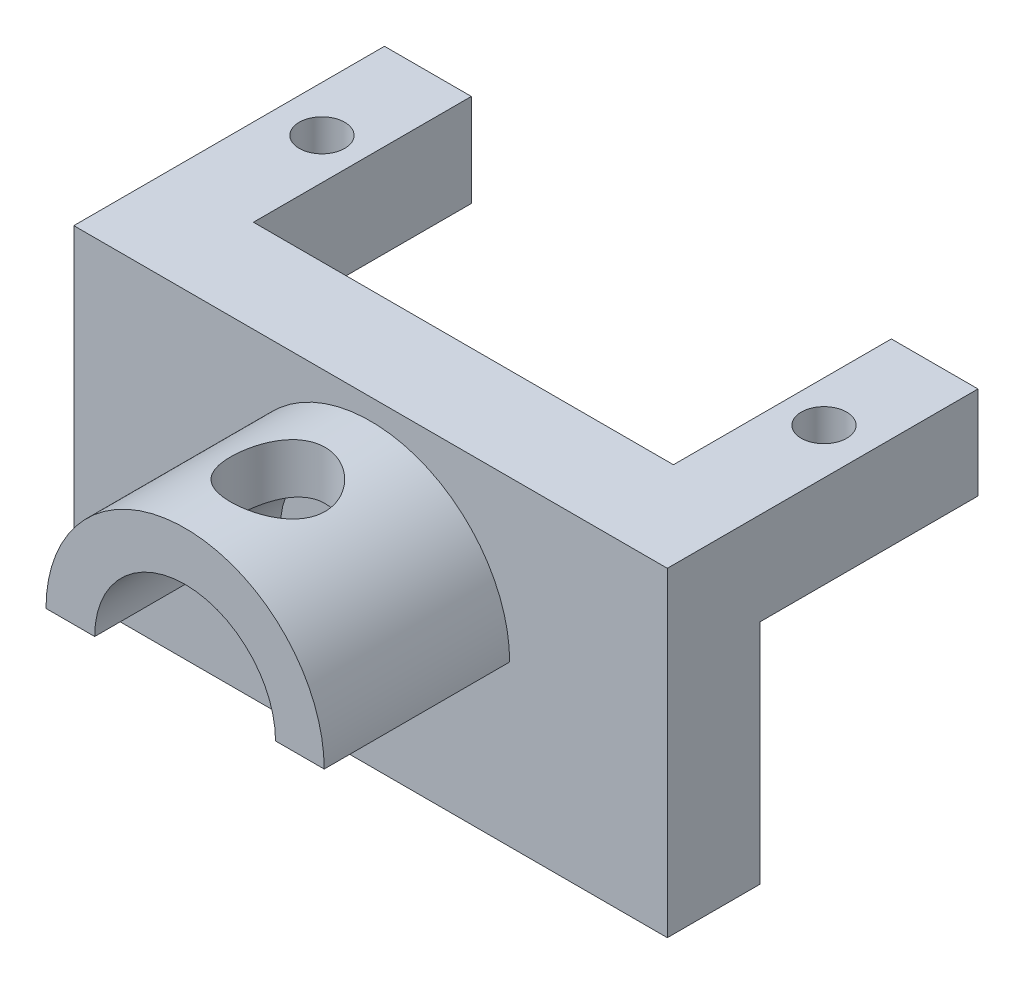
ISO-10303-21;
HEADER;
FILE_DESCRIPTION(('STEP AP214'),'2;1');
FILE_NAME('part.step','',(''),(''),'','','');
FILE_SCHEMA(('AUTOMOTIVE_DESIGN { 1 0 10303 214 1 1 1 1 }'));
ENDSEC;
DATA;
#1=APPLICATION_CONTEXT('core data for automotive mechanical design processes');
#2=APPLICATION_PROTOCOL_DEFINITION('international standard','automotive_design',2000,#1);
#3=PRODUCT_CONTEXT('',#1,'mechanical');
#4=PRODUCT('Part','Part','',(#3));
#5=PRODUCT_RELATED_PRODUCT_CATEGORY('part','',(#4));
#6=PRODUCT_DEFINITION_FORMATION('','',#4);
#7=PRODUCT_DEFINITION_CONTEXT('part definition',#1,'design');
#8=PRODUCT_DEFINITION('design','',#6,#7);
#9=PRODUCT_DEFINITION_SHAPE('','',#8);
#10=(LENGTH_UNIT() NAMED_UNIT(*) SI_UNIT(.MILLI.,.METRE.));
#11=(NAMED_UNIT(*) PLANE_ANGLE_UNIT() SI_UNIT($,.RADIAN.));
#12=(NAMED_UNIT(*) SI_UNIT($,.STERADIAN.) SOLID_ANGLE_UNIT());
#13=UNCERTAINTY_MEASURE_WITH_UNIT(LENGTH_MEASURE(1.E-05),#10,'distance_accuracy_value','');
#14=(GEOMETRIC_REPRESENTATION_CONTEXT(3) GLOBAL_UNCERTAINTY_ASSIGNED_CONTEXT((#13)) GLOBAL_UNIT_ASSIGNED_CONTEXT((#10,
#11,#12)) REPRESENTATION_CONTEXT('',''));
#15=CARTESIAN_POINT('',(0.,0.,0.));
#16=DIRECTION('',(0.,0.,1.));
#17=DIRECTION('',(1.,0.,0.));
#18=AXIS2_PLACEMENT_3D('',#15,#16,#17);
#19=CARTESIAN_POINT('',(0.,0.,5.08));
#20=DIRECTION('',(0.,0.,-1.));
#21=DIRECTION('',(-1.,0.,0.));
#22=AXIS2_PLACEMENT_3D('',#19,#20,#21);
#23=PLANE('',#22);
#24=DIRECTION('',(0.,1.,0.));
#25=VECTOR('',#24,1.);
#26=CARTESIAN_POINT('',(16.256,-8.763,5.08));
#27=LINE('',#26,#25);
#28=CARTESIAN_POINT('',(16.256,-8.763,5.08));
#29=VERTEX_POINT('',#28);
#30=CARTESIAN_POINT('',(16.256,8.763,5.08));
#31=VERTEX_POINT('',#30);
#32=EDGE_CURVE('E261',#29,#31,#27,.T.);
#33=ORIENTED_EDGE('',*,*,#32,.T.);
#34=DIRECTION('',(-1.,0.,0.));
#35=VECTOR('',#34,1.);
#36=CARTESIAN_POINT('',(-16.256,8.763,5.08));
#37=LINE('',#36,#35);
#38=CARTESIAN_POINT('',(-16.256,8.763,5.08));
#39=VERTEX_POINT('',#38);
#40=EDGE_CURVE('E265',#31,#39,#37,.T.);
#41=ORIENTED_EDGE('',*,*,#40,.T.);
#42=DIRECTION('',(0.,-1.,0.));
#43=VECTOR('',#42,1.);
#44=CARTESIAN_POINT('',(-16.256,-8.763,5.08));
#45=LINE('',#44,#43);
#46=CARTESIAN_POINT('',(-16.256,-8.763,5.08));
#47=VERTEX_POINT('',#46);
#48=EDGE_CURVE('E269',#39,#47,#45,.T.);
#49=ORIENTED_EDGE('',*,*,#48,.T.);
#50=DIRECTION('',(1.,0.,0.));
#51=VECTOR('',#50,1.);
#52=CARTESIAN_POINT('',(-16.256,-8.763,5.08));
#53=LINE('',#52,#51);
#54=EDGE_CURVE('E272',#47,#29,#53,.T.);
#55=ORIENTED_EDGE('',*,*,#54,.T.);
#56=EDGE_LOOP('',(#33,#41,#49,#55));
#57=FACE_BOUND('',#56,.T.);
#58=CARTESIAN_POINT('',(0.,0.,5.08));
#59=DIRECTION('',(0.,0.,1.));
#60=DIRECTION('',(1.,0.,0.));
#61=AXIS2_PLACEMENT_3D('',#58,#59,#60);
#62=CIRCLE('',#61,7.62);
#63=CARTESIAN_POINT('',(7.62,0.,5.08));
#64=VERTEX_POINT('',#63);
#65=CARTESIAN_POINT('',(-7.62,0.,5.08));
#66=VERTEX_POINT('',#65);
#67=EDGE_CURVE('E172',#64,#66,#62,.T.);
#68=ORIENTED_EDGE('',*,*,#67,.F.);
#69=DIRECTION('',(1.,0.,0.));
#70=VECTOR('',#69,1.);
#71=CARTESIAN_POINT('',(7.62,0.,5.08));
#72=LINE('',#71,#70);
#73=CARTESIAN_POINT('',(4.953,0.,5.08));
#74=VERTEX_POINT('',#73);
#75=EDGE_CURVE('E169',#74,#64,#72,.T.);
#76=ORIENTED_EDGE('',*,*,#75,.F.);
#77=CARTESIAN_POINT('',(0.,0.,5.08));
#78=DIRECTION('',(0.,0.,-1.));
#79=DIRECTION('',(1.,0.,0.));
#80=AXIS2_PLACEMENT_3D('',#77,#78,#79);
#81=CIRCLE('',#80,4.953);
#82=CARTESIAN_POINT('',(-4.953,0.,5.08));
#83=VERTEX_POINT('',#82);
#84=EDGE_CURVE('E69',#83,#74,#81,.T.);
#85=ORIENTED_EDGE('',*,*,#84,.F.);
#86=DIRECTION('',(1.,0.,0.));
#87=VECTOR('',#86,1.);
#88=CARTESIAN_POINT('',(-4.953,0.,5.08));
#89=LINE('',#88,#87);
#90=EDGE_CURVE('E64',#66,#83,#89,.T.);
#91=ORIENTED_EDGE('',*,*,#90,.F.);
#92=EDGE_LOOP('',(#68,#76,#85,#91));
#93=FACE_BOUND('',#92,.T.);
#94=ADVANCED_FACE('F43',(#57,#93),#23,.F.);
#95=CARTESIAN_POINT('',(0.,0.,0.));
#96=DIRECTION('',(0.,0.,-1.));
#97=DIRECTION('',(-1.,0.,0.));
#98=AXIS2_PLACEMENT_3D('',#95,#96,#97);
#99=PLANE('',#98);
#100=DIRECTION('',(0.,1.,0.));
#101=VECTOR('',#100,1.);
#102=CARTESIAN_POINT('',(11.5099999999998,8.76299999999999,0.));
#103=LINE('',#102,#101);
#104=CARTESIAN_POINT('',(11.5099999999998,3.68299999999999,0.));
#105=VERTEX_POINT('',#104);
#106=CARTESIAN_POINT('',(11.5099999999998,8.763,0.));
#107=VERTEX_POINT('',#106);
#108=EDGE_CURVE('E207',#105,#107,#103,.T.);
#109=ORIENTED_EDGE('',*,*,#108,.F.);
#110=DIRECTION('',(-1.,0.,0.));
#111=VECTOR('',#110,1.);
#112=CARTESIAN_POINT('',(16.256,3.68299999999999,0.));
#113=LINE('',#112,#111);
#114=CARTESIAN_POINT('',(16.256,3.68299999999999,0.));
#115=VERTEX_POINT('',#114);
#116=EDGE_CURVE('E211',#115,#105,#113,.T.);
#117=ORIENTED_EDGE('',*,*,#116,.F.);
#118=DIRECTION('',(0.,1.,0.));
#119=VECTOR('',#118,1.);
#120=CARTESIAN_POINT('',(16.256,-8.763,0.));
#121=LINE('',#120,#119);
#122=CARTESIAN_POINT('',(16.256,-8.763,0.));
#123=VERTEX_POINT('',#122);
#124=EDGE_CURVE('E260',#123,#115,#121,.T.);
#125=ORIENTED_EDGE('',*,*,#124,.F.);
#126=DIRECTION('',(1.,0.,0.));
#127=VECTOR('',#126,1.);
#128=CARTESIAN_POINT('',(-16.256,-8.763,0.));
#129=LINE('',#128,#127);
#130=CARTESIAN_POINT('',(-16.256,-8.763,0.));
#131=VERTEX_POINT('',#130);
#132=EDGE_CURVE('E266',#131,#123,#129,.T.);
#133=ORIENTED_EDGE('',*,*,#132,.F.);
#134=DIRECTION('',(0.,-1.,0.));
#135=VECTOR('',#134,1.);
#136=CARTESIAN_POINT('',(-16.256,-8.763,0.));
#137=LINE('',#136,#135);
#138=CARTESIAN_POINT('',(-16.256,3.68299999999999,0.));
#139=VERTEX_POINT('',#138);
#140=EDGE_CURVE('E282',#139,#131,#137,.T.);
#141=ORIENTED_EDGE('',*,*,#140,.F.);
#142=DIRECTION('',(-1.,0.,0.));
#143=VECTOR('',#142,1.);
#144=CARTESIAN_POINT('',(-16.256,3.68299999999999,0.));
#145=LINE('',#144,#143);
#146=CARTESIAN_POINT('',(-11.4980000000002,3.68299999999999,0.));
#147=VERTEX_POINT('',#146);
#148=EDGE_CURVE('E233',#147,#139,#145,.T.);
#149=ORIENTED_EDGE('',*,*,#148,.F.);
#150=DIRECTION('',(0.,-1.,0.));
#151=VECTOR('',#150,1.);
#152=CARTESIAN_POINT('',(-11.4980000000002,8.763,0.));
#153=LINE('',#152,#151);
#154=CARTESIAN_POINT('',(-11.4980000000002,8.763,0.));
#155=VERTEX_POINT('',#154);
#156=EDGE_CURVE('E215',#155,#147,#153,.T.);
#157=ORIENTED_EDGE('',*,*,#156,.F.);
#158=DIRECTION('',(-1.,0.,0.));
#159=VECTOR('',#158,1.);
#160=CARTESIAN_POINT('',(-16.256,8.763,0.));
#161=LINE('',#160,#159);
#162=EDGE_CURVE('E279',#107,#155,#161,.T.);
#163=ORIENTED_EDGE('',*,*,#162,.F.);
#164=EDGE_LOOP('',(#109,#117,#125,#133,#141,#149,#157,#163));
#165=FACE_BOUND('',#164,.T.);
#166=ADVANCED_FACE('F317',(#165),#99,.T.);
#167=CARTESIAN_POINT('',(16.256,-8.763,5.08));
#168=DIRECTION('',(-1.,0.,0.));
#169=DIRECTION('',(0.,0.,1.));
#170=AXIS2_PLACEMENT_3D('',#167,#168,#169);
#171=PLANE('',#170);
#172=ORIENTED_EDGE('',*,*,#124,.T.);
#173=DIRECTION('',(0.,0.,1.));
#174=VECTOR('',#173,1.);
#175=CARTESIAN_POINT('',(16.256,3.68299999999999,-11.938));
#176=LINE('',#175,#174);
#177=CARTESIAN_POINT('',(16.256,3.68299999999999,-11.938));
#178=VERTEX_POINT('',#177);
#179=EDGE_CURVE('E196',#178,#115,#176,.T.);
#180=ORIENTED_EDGE('',*,*,#179,.F.);
#181=DIRECTION('',(0.,-1.,0.));
#182=VECTOR('',#181,1.);
#183=CARTESIAN_POINT('',(16.256,8.763,-11.938));
#184=LINE('',#183,#182);
#185=CARTESIAN_POINT('',(16.256,8.763,-11.938));
#186=VERTEX_POINT('',#185);
#187=EDGE_CURVE('E212',#186,#178,#184,.T.);
#188=ORIENTED_EDGE('',*,*,#187,.F.);
#189=DIRECTION('',(0.,0.,-1.));
#190=VECTOR('',#189,1.);
#191=CARTESIAN_POINT('',(16.256,8.763,5.08));
#192=LINE('',#191,#190);
#193=EDGE_CURVE('E57',#31,#186,#192,.T.);
#194=ORIENTED_EDGE('',*,*,#193,.F.);
#195=ORIENTED_EDGE('',*,*,#32,.F.);
#196=DIRECTION('',(0.,0.,-1.));
#197=VECTOR('',#196,1.);
#198=CARTESIAN_POINT('',(16.256,-8.763,5.08));
#199=LINE('',#198,#197);
#200=EDGE_CURVE('E275',#29,#123,#199,.T.);
#201=ORIENTED_EDGE('',*,*,#200,.T.);
#202=EDGE_LOOP('',(#172,#180,#188,#194,#195,#201));
#203=FACE_BOUND('',#202,.T.);
#204=ADVANCED_FACE('F45',(#203),#171,.F.);
#205=CARTESIAN_POINT('',(-16.256,8.763,5.08));
#206=DIRECTION('',(0.,-1.,0.));
#207=DIRECTION('',(0.,0.,-1.));
#208=AXIS2_PLACEMENT_3D('',#205,#206,#207);
#209=PLANE('',#208);
#210=CARTESIAN_POINT('',(-13.744,8.763,-6.00000000000006));
#211=DIRECTION('',(0.,1.,0.));
#212=DIRECTION('',(0.,0.,1.));
#213=AXIS2_PLACEMENT_3D('',#210,#211,#212);
#214=CIRCLE('',#213,1.24459999999999);
#215=CARTESIAN_POINT('',(-13.744,8.763,-4.75540000000007));
#216=VERTEX_POINT('',#215);
#217=EDGE_CURVE('E174',#216,#216,#214,.T.);
#218=ORIENTED_EDGE('',*,*,#217,.F.);
#219=EDGE_LOOP('',(#218));
#220=FACE_BOUND('',#219,.T.);
#221=CARTESIAN_POINT('',(13.7559999999999,8.763,-6.00000000000006));
#222=DIRECTION('',(0.,1.,0.));
#223=DIRECTION('',(0.,0.,1.));
#224=AXIS2_PLACEMENT_3D('',#221,#222,#223);
#225=CIRCLE('',#224,1.24459999999999);
#226=CARTESIAN_POINT('',(13.7559999999999,8.763,-4.75540000000008));
#227=VERTEX_POINT('',#226);
#228=EDGE_CURVE('E188',#227,#227,#225,.T.);
#229=ORIENTED_EDGE('',*,*,#228,.F.);
#230=EDGE_LOOP('',(#229));
#231=FACE_BOUND('',#230,.T.);
#232=ORIENTED_EDGE('',*,*,#193,.T.);
#233=DIRECTION('',(1.,0.,0.));
#234=VECTOR('',#233,1.);
#235=CARTESIAN_POINT('',(16.256,8.763,-11.938));
#236=LINE('',#235,#234);
#237=CARTESIAN_POINT('',(11.5099999999998,8.76299999999999,-11.938));
#238=VERTEX_POINT('',#237);
#239=EDGE_CURVE('E206',#238,#186,#236,.T.);
#240=ORIENTED_EDGE('',*,*,#239,.F.);
#241=DIRECTION('',(0.,0.,1.));
#242=VECTOR('',#241,1.);
#243=CARTESIAN_POINT('',(11.5099999999998,8.76299999999999,-11.938));
#244=LINE('',#243,#242);
#245=EDGE_CURVE('E203',#238,#107,#244,.T.);
#246=ORIENTED_EDGE('',*,*,#245,.T.);
#247=ORIENTED_EDGE('',*,*,#162,.T.);
#248=DIRECTION('',(0.,0.,1.));
#249=VECTOR('',#248,1.);
#250=CARTESIAN_POINT('',(-11.4980000000002,8.763,-11.938));
#251=LINE('',#250,#249);
#252=CARTESIAN_POINT('',(-11.4980000000002,8.763,-11.938));
#253=VERTEX_POINT('',#252);
#254=EDGE_CURVE('E256',#253,#155,#251,.T.);
#255=ORIENTED_EDGE('',*,*,#254,.F.);
#256=DIRECTION('',(1.,0.,0.));
#257=VECTOR('',#256,1.);
#258=CARTESIAN_POINT('',(-16.256,8.763,-11.938));
#259=LINE('',#258,#257);
#260=CARTESIAN_POINT('',(-16.256,8.763,-11.938));
#261=VERTEX_POINT('',#260);
#262=EDGE_CURVE('E232',#261,#253,#259,.T.);
#263=ORIENTED_EDGE('',*,*,#262,.F.);
#264=DIRECTION('',(0.,0.,-1.));
#265=VECTOR('',#264,1.);
#266=CARTESIAN_POINT('',(-16.256,8.763,5.08));
#267=LINE('',#266,#265);
#268=EDGE_CURVE('E294',#39,#261,#267,.T.);
#269=ORIENTED_EDGE('',*,*,#268,.F.);
#270=ORIENTED_EDGE('',*,*,#40,.F.);
#271=EDGE_LOOP('',(#232,#240,#246,#247,#255,#263,#269,#270));
#272=FACE_BOUND('',#271,.T.);
#273=ADVANCED_FACE('F300',(#220,#231,#272),#209,.F.);
#274=CARTESIAN_POINT('',(-16.256,-8.763,5.08));
#275=DIRECTION('',(1.,0.,0.));
#276=DIRECTION('',(0.,0.,-1.));
#277=AXIS2_PLACEMENT_3D('',#274,#275,#276);
#278=PLANE('',#277);
#279=ORIENTED_EDGE('',*,*,#268,.T.);
#280=DIRECTION('',(0.,1.,0.));
#281=VECTOR('',#280,1.);
#282=CARTESIAN_POINT('',(-16.256,8.763,-11.938));
#283=LINE('',#282,#281);
#284=CARTESIAN_POINT('',(-16.256,3.68299999999999,-11.938));
#285=VERTEX_POINT('',#284);
#286=EDGE_CURVE('E228',#285,#261,#283,.T.);
#287=ORIENTED_EDGE('',*,*,#286,.F.);
#288=DIRECTION('',(0.,0.,1.));
#289=VECTOR('',#288,1.);
#290=CARTESIAN_POINT('',(-16.256,3.68299999999999,-11.938));
#291=LINE('',#290,#289);
#292=EDGE_CURVE('E242',#285,#139,#291,.T.);
#293=ORIENTED_EDGE('',*,*,#292,.T.);
#294=ORIENTED_EDGE('',*,*,#140,.T.);
#295=DIRECTION('',(0.,0.,-1.));
#296=VECTOR('',#295,1.);
#297=CARTESIAN_POINT('',(-16.256,-8.763,5.08));
#298=LINE('',#297,#296);
#299=EDGE_CURVE('E290',#47,#131,#298,.T.);
#300=ORIENTED_EDGE('',*,*,#299,.F.);
#301=ORIENTED_EDGE('',*,*,#48,.F.);
#302=EDGE_LOOP('',(#279,#287,#293,#294,#300,#301));
#303=FACE_BOUND('',#302,.T.);
#304=ADVANCED_FACE('F337',(#303),#278,.F.);
#305=CARTESIAN_POINT('',(-16.256,-8.763,5.08));
#306=DIRECTION('',(0.,1.,0.));
#307=DIRECTION('',(0.,0.,1.));
#308=AXIS2_PLACEMENT_3D('',#305,#306,#307);
#309=PLANE('',#308);
#310=ORIENTED_EDGE('',*,*,#132,.T.);
#311=ORIENTED_EDGE('',*,*,#200,.F.);
#312=ORIENTED_EDGE('',*,*,#54,.F.);
#313=ORIENTED_EDGE('',*,*,#299,.T.);
#314=EDGE_LOOP('',(#310,#311,#312,#313));
#315=FACE_BOUND('',#314,.T.);
#316=ADVANCED_FACE('F342',(#315),#309,.F.);
#317=CARTESIAN_POINT('',(-11.4980000000002,8.763,-11.938));
#318=DIRECTION('',(-1.,0.,0.));
#319=DIRECTION('',(0.,-1.,0.));
#320=AXIS2_PLACEMENT_3D('',#317,#318,#319);
#321=PLANE('',#320);
#322=ORIENTED_EDGE('',*,*,#156,.T.);
#323=DIRECTION('',(0.,0.,1.));
#324=VECTOR('',#323,1.);
#325=CARTESIAN_POINT('',(-11.4980000000002,3.68299999999999,-11.938));
#326=LINE('',#325,#324);
#327=CARTESIAN_POINT('',(-11.4980000000002,3.68299999999999,-11.938));
#328=VERTEX_POINT('',#327);
#329=EDGE_CURVE('E252',#328,#147,#326,.T.);
#330=ORIENTED_EDGE('',*,*,#329,.F.);
#331=DIRECTION('',(0.,-1.,0.));
#332=VECTOR('',#331,1.);
#333=CARTESIAN_POINT('',(-11.4980000000002,8.763,-11.938));
#334=LINE('',#333,#332);
#335=EDGE_CURVE('E236',#253,#328,#334,.T.);
#336=ORIENTED_EDGE('',*,*,#335,.F.);
#337=ORIENTED_EDGE('',*,*,#254,.T.);
#338=EDGE_LOOP('',(#322,#330,#336,#337));
#339=FACE_BOUND('',#338,.T.);
#340=ADVANCED_FACE('F328',(#339),#321,.F.);
#341=CARTESIAN_POINT('',(-16.256,3.68299999999999,-11.938));
#342=DIRECTION('',(0.,1.,0.));
#343=DIRECTION('',(-1.,0.,0.));
#344=AXIS2_PLACEMENT_3D('',#341,#342,#343);
#345=PLANE('',#344);
#346=CARTESIAN_POINT('',(-13.744,3.68299999999999,-6.00000000000006));
#347=DIRECTION('',(0.,1.,0.));
#348=DIRECTION('',(-1.,0.,0.));
#349=AXIS2_PLACEMENT_3D('',#346,#347,#348);
#350=CIRCLE('',#349,1.24459999999989);
#351=CARTESIAN_POINT('',(-14.9885999999999,3.68299999999999,-6.00000000000006));
#352=VERTEX_POINT('',#351);
#353=EDGE_CURVE('E179',#352,#352,#350,.T.);
#354=ORIENTED_EDGE('',*,*,#353,.T.);
#355=EDGE_LOOP('',(#354));
#356=FACE_BOUND('',#355,.T.);
#357=ORIENTED_EDGE('',*,*,#148,.T.);
#358=ORIENTED_EDGE('',*,*,#292,.F.);
#359=DIRECTION('',(-1.,0.,0.));
#360=VECTOR('',#359,1.);
#361=CARTESIAN_POINT('',(-16.256,3.68299999999999,-11.938));
#362=LINE('',#361,#360);
#363=EDGE_CURVE('E239',#328,#285,#362,.T.);
#364=ORIENTED_EDGE('',*,*,#363,.F.);
#365=ORIENTED_EDGE('',*,*,#329,.T.);
#366=EDGE_LOOP('',(#357,#358,#364,#365));
#367=FACE_BOUND('',#366,.T.);
#368=ADVANCED_FACE('F344',(#356,#367),#345,.F.);
#369=CARTESIAN_POINT('',(0.,0.,-11.938));
#370=DIRECTION('',(0.,0.,1.));
#371=DIRECTION('',(1.,0.,0.));
#372=AXIS2_PLACEMENT_3D('',#369,#370,#371);
#373=PLANE('',#372);
#374=ORIENTED_EDGE('',*,*,#286,.T.);
#375=ORIENTED_EDGE('',*,*,#262,.T.);
#376=ORIENTED_EDGE('',*,*,#335,.T.);
#377=ORIENTED_EDGE('',*,*,#363,.T.);
#378=EDGE_LOOP('',(#374,#375,#376,#377));
#379=FACE_BOUND('',#378,.T.);
#380=ADVANCED_FACE('F331',(#379),#373,.F.);
#381=CARTESIAN_POINT('',(16.256,3.68299999999999,-11.938));
#382=DIRECTION('',(0.,1.,0.));
#383=DIRECTION('',(0.,0.,1.));
#384=AXIS2_PLACEMENT_3D('',#381,#382,#383);
#385=PLANE('',#384);
#386=CARTESIAN_POINT('',(13.7559999999999,3.68299999999999,-6.00000000000006));
#387=DIRECTION('',(0.,1.,0.));
#388=DIRECTION('',(0.,0.,1.));
#389=AXIS2_PLACEMENT_3D('',#386,#387,#388);
#390=CIRCLE('',#389,1.24459999999989);
#391=CARTESIAN_POINT('',(13.7559999999999,3.68299999999999,-4.75540000000018));
#392=VERTEX_POINT('',#391);
#393=EDGE_CURVE('E192',#392,#392,#390,.T.);
#394=ORIENTED_EDGE('',*,*,#393,.T.);
#395=EDGE_LOOP('',(#394));
#396=FACE_BOUND('',#395,.T.);
#397=ORIENTED_EDGE('',*,*,#116,.T.);
#398=DIRECTION('',(0.,0.,1.));
#399=VECTOR('',#398,1.);
#400=CARTESIAN_POINT('',(11.5099999999998,3.68299999999999,-11.938));
#401=LINE('',#400,#399);
#402=CARTESIAN_POINT('',(11.5099999999998,3.68299999999999,-11.938));
#403=VERTEX_POINT('',#402);
#404=EDGE_CURVE('E199',#403,#105,#401,.T.);
#405=ORIENTED_EDGE('',*,*,#404,.F.);
#406=DIRECTION('',(-1.,0.,0.));
#407=VECTOR('',#406,1.);
#408=CARTESIAN_POINT('',(16.256,3.68299999999999,-11.938));
#409=LINE('',#408,#407);
#410=EDGE_CURVE('E222',#178,#403,#409,.T.);
#411=ORIENTED_EDGE('',*,*,#410,.F.);
#412=ORIENTED_EDGE('',*,*,#179,.T.);
#413=EDGE_LOOP('',(#397,#405,#411,#412));
#414=FACE_BOUND('',#413,.T.);
#415=ADVANCED_FACE('F313',(#396,#414),#385,.F.);
#416=CARTESIAN_POINT('',(11.5099999999998,8.76299999999999,-11.938));
#417=DIRECTION('',(1.,0.,0.));
#418=DIRECTION('',(0.,1.,0.));
#419=AXIS2_PLACEMENT_3D('',#416,#417,#418);
#420=PLANE('',#419);
#421=ORIENTED_EDGE('',*,*,#108,.T.);
#422=ORIENTED_EDGE('',*,*,#245,.F.);
#423=DIRECTION('',(0.,1.,0.));
#424=VECTOR('',#423,1.);
#425=CARTESIAN_POINT('',(11.5099999999998,8.76299999999999,-11.938));
#426=LINE('',#425,#424);
#427=EDGE_CURVE('E219',#403,#238,#426,.T.);
#428=ORIENTED_EDGE('',*,*,#427,.F.);
#429=ORIENTED_EDGE('',*,*,#404,.T.);
#430=EDGE_LOOP('',(#421,#422,#428,#429));
#431=FACE_BOUND('',#430,.T.);
#432=ADVANCED_FACE('F322',(#431),#420,.F.);
#433=CARTESIAN_POINT('',(0.,0.,-11.938));
#434=DIRECTION('',(0.,0.,-1.));
#435=DIRECTION('',(-1.,0.,0.));
#436=AXIS2_PLACEMENT_3D('',#433,#434,#435);
#437=PLANE('',#436);
#438=ORIENTED_EDGE('',*,*,#187,.T.);
#439=ORIENTED_EDGE('',*,*,#410,.T.);
#440=ORIENTED_EDGE('',*,*,#427,.T.);
#441=ORIENTED_EDGE('',*,*,#239,.T.);
#442=EDGE_LOOP('',(#438,#439,#440,#441));
#443=FACE_BOUND('',#442,.T.);
#444=ADVANCED_FACE('F306',(#443),#437,.T.);
#445=CARTESIAN_POINT('',(13.7559999999999,8.763,-6.00000000000006));
#446=DIRECTION('',(0.,1.,0.));
#447=DIRECTION('',(0.,0.,1.));
#448=AXIS2_PLACEMENT_3D('',#445,#446,#447);
#449=CYLINDRICAL_SURFACE('',#448,1.24459999999989);
#450=ORIENTED_EDGE('',*,*,#228,.T.);
#451=EDGE_LOOP('',(#450));
#452=FACE_BOUND('',#451,.T.);
#453=ORIENTED_EDGE('',*,*,#393,.F.);
#454=EDGE_LOOP('',(#453));
#455=FACE_BOUND('',#454,.T.);
#456=ADVANCED_FACE('F373',(#452,#455),#449,.F.);
#457=CARTESIAN_POINT('',(-13.744,8.763,-6.00000000000006));
#458=DIRECTION('',(0.,1.,0.));
#459=DIRECTION('',(0.,0.,1.));
#460=AXIS2_PLACEMENT_3D('',#457,#458,#459);
#461=CYLINDRICAL_SURFACE('',#460,1.24459999999989);
#462=ORIENTED_EDGE('',*,*,#217,.T.);
#463=EDGE_LOOP('',(#462));
#464=FACE_BOUND('',#463,.T.);
#465=ORIENTED_EDGE('',*,*,#353,.F.);
#466=EDGE_LOOP('',(#465));
#467=FACE_BOUND('',#466,.T.);
#468=ADVANCED_FACE('F376',(#464,#467),#461,.F.);
#469=CARTESIAN_POINT('',(0.,0.,15.24));
#470=DIRECTION('',(0.,0.,-1.));
#471=DIRECTION('',(-1.,0.,0.));
#472=AXIS2_PLACEMENT_3D('',#469,#470,#471);
#473=CYLINDRICAL_SURFACE('',#472,7.62);
#474=CARTESIAN_POINT('',(0.,7.62,12.7508));
#475=CARTESIAN_POINT('',(-0.141201231390702,7.62000082257172,12.7508012393376));
#476=CARTESIAN_POINT('',(-0.28239390953779,7.61603934881257,12.7392192258313));
#477=CARTESIAN_POINT('',(-0.560610836347875,7.60062727043279,12.6933458406469));
#478=CARTESIAN_POINT('',(-0.697634817040988,7.58917618542917,12.6590530122973));
#479=CARTESIAN_POINT('',(-0.963463288553017,7.56002686518183,12.5690761295682));
#480=CARTESIAN_POINT('',(-1.09228141303301,7.54233932902228,12.5134286962038));
#481=CARTESIAN_POINT('',(-1.33875498973631,7.50251567257796,12.38249094613));
#482=CARTESIAN_POINT('',(-1.45640809632246,7.48037862053541,12.3071965142242));
#483=CARTESIAN_POINT('',(-1.6814307968151,7.43309117098398,12.1362687577811));
#484=CARTESIAN_POINT('',(-1.78834504279076,7.40786649847924,12.0400566567175));
#485=CARTESIAN_POINT('',(-1.98487182684994,7.35764854382095,11.8312547936797));
#486=CARTESIAN_POINT('',(-2.07448034586049,7.33265531669815,11.7186612379046));
#487=CARTESIAN_POINT('',(-2.23649554697159,7.28490584461171,11.4761402504815));
#488=CARTESIAN_POINT('',(-2.3083025474002,7.26223969618295,11.3457927437915));
#489=CARTESIAN_POINT('',(-2.42877962918076,7.22284409593496,11.0739765348821));
#490=CARTESIAN_POINT('',(-2.4774570980295,7.20611274899292,10.932511400443));
#491=CARTESIAN_POINT('',(-2.54857127585569,7.18126503632514,10.6476650448502));
#492=CARTESIAN_POINT('',(-2.57186385593196,7.17286859593096,10.5045226699522));
#493=CARTESIAN_POINT('',(-2.59422293428982,7.16481417594883,10.2161340975334));
#494=CARTESIAN_POINT('',(-2.59329728070739,7.16515336550102,10.0708885967983));
#495=CARTESIAN_POINT('',(-2.56790911782427,7.17428703853549,9.78979300104377));
#496=CARTESIAN_POINT('',(-2.5445736786935,7.18267662223693,9.65382564812264));
#497=CARTESIAN_POINT('',(-2.47687073755881,7.206301660429,9.38786510286881));
#498=CARTESIAN_POINT('',(-2.43250062178736,7.22153796568052,9.25787265518007));
#499=CARTESIAN_POINT('',(-2.32326882892045,7.25742115399696,9.0050321064861));
#500=CARTESIAN_POINT('',(-2.25807971486471,7.27815352613501,8.88233812338519));
#501=CARTESIAN_POINT('',(-2.10928777429796,7.32265813651381,8.64927887177282));
#502=CARTESIAN_POINT('',(-2.02567945875962,7.34643128003421,8.53891729319636));
#503=CARTESIAN_POINT('',(-1.83704864521443,7.3959211847145,8.3273360441293));
#504=CARTESIAN_POINT('',(-1.73110791213586,7.4216732871496,8.22694154849613));
#505=CARTESIAN_POINT('',(-1.50357947894164,7.47108997151951,8.04512366420706));
#506=CARTESIAN_POINT('',(-1.38199015637632,7.49475433656778,7.96370224514818));
#507=CARTESIAN_POINT('',(-1.1248121984488,7.5376620812364,7.82144133652709));
#508=CARTESIAN_POINT('',(-0.989087854813078,7.55685551769822,7.76083107514155));
#509=CARTESIAN_POINT('',(-0.708559742101235,7.58829527948327,7.66356158658515));
#510=CARTESIAN_POINT('',(-0.56375928086775,7.60054411964208,7.62689368847393));
#511=CARTESIAN_POINT('',(-0.27616879911587,7.61629405163747,7.58003055107277));
#512=CARTESIAN_POINT('',(-0.133580290033841,7.62016312689874,7.5687209053129));
#513=CARTESIAN_POINT('',(0.151490619612348,7.6198263489569,7.56971004825709));
#514=CARTESIAN_POINT('',(0.293973034466557,7.61562192141516,7.58200466879624));
#515=CARTESIAN_POINT('',(0.570272909287012,7.59985360935718,7.6289762994241));
#516=CARTESIAN_POINT('',(0.704222107104841,7.58851708227369,7.66296229909853));
#517=CARTESIAN_POINT('',(0.964457739703709,7.55985271697872,7.75148104229071));
#518=CARTESIAN_POINT('',(1.09074318807275,7.54252410943261,7.80601642426352));
#519=CARTESIAN_POINT('',(1.33585216819954,7.50304821240776,7.93570581742393));
#520=CARTESIAN_POINT('',(1.45438399177327,7.48078394829388,8.01137451253111));
#521=CARTESIAN_POINT('',(1.67742599673822,7.43395259682712,8.18058179056644));
#522=CARTESIAN_POINT('',(1.78193172698304,7.40938478262991,8.27412602353331));
#523=CARTESIAN_POINT('',(1.97911121345106,7.35923665863006,8.48166608453749));
#524=CARTESIAN_POINT('',(2.07098998862488,7.33366351493912,8.59642079822324));
#525=CARTESIAN_POINT('',(2.23429385524774,7.28557487237232,8.8402634744284));
#526=CARTESIAN_POINT('',(2.30571857474349,7.26305942910411,8.96935169754086));
#527=CARTESIAN_POINT('',(2.4258036495075,7.22384146052577,9.23838031230971));
#528=CARTESIAN_POINT('',(2.4744929157081,7.20713155971542,9.37830665637532));
#529=CARTESIAN_POINT('',(2.54738202665678,7.18169646882584,9.66507646901681));
#530=CARTESIAN_POINT('',(2.57159349934469,7.17296748767633,9.81191661852726));
#531=CARTESIAN_POINT('',(2.59391072917946,7.16492521861279,10.0999088446973));
#532=CARTESIAN_POINT('',(2.59334132687988,7.16513408311513,10.2409460107126));
#533=CARTESIAN_POINT('',(2.56939412822854,7.17375578399254,10.5208018596336));
#534=CARTESIAN_POINT('',(2.54601779633617,7.18216809361487,10.6596206843999));
#535=CARTESIAN_POINT('',(2.47807380137546,7.20588615768103,10.9282475891773));
#536=CARTESIAN_POINT('',(2.4339519594171,7.22104654655965,11.0581822861288));
#537=CARTESIAN_POINT('',(2.3261348004635,7.25649378467521,11.3089016406201));
#538=CARTESIAN_POINT('',(2.26243503102001,7.27678179985969,11.429684208969));
#539=CARTESIAN_POINT('',(2.11392256020157,7.32133809102504,11.6645743064835));
#540=CARTESIAN_POINT('',(2.02828763072569,7.34574455488114,11.778135574668));
#541=CARTESIAN_POINT('',(1.83970730466999,7.39522607709018,11.9897034217241));
#542=CARTESIAN_POINT('',(1.73675692170472,7.42030132628012,12.0877055041196));
#543=CARTESIAN_POINT('',(1.51138224799755,7.46953452473747,12.269447431641));
#544=CARTESIAN_POINT('',(1.38833074487049,7.49361221532406,12.3524340523184));
#545=CARTESIAN_POINT('',(1.12922163695765,7.53700753307912,12.4964630065772));
#546=CARTESIAN_POINT('',(0.99316674318046,7.55632614945032,12.5575099016775));
#547=CARTESIAN_POINT('',(0.716271185816336,7.58749907268525,12.653995243605));
#548=CARTESIAN_POINT('',(0.575714393083278,7.59956845482867,12.6901767119025));
#549=CARTESIAN_POINT('',(0.290101135363165,7.61581729408998,12.7385748028527));
#550=CARTESIAN_POINT('',(0.145046054989301,7.61999915503015,12.750798726916));
#551=CARTESIAN_POINT('',(0.,7.62,12.7508));
#552=B_SPLINE_CURVE_WITH_KNOTS('',3,(#474,#475,#476,#477,#478,#479,#480,#481,#482,#483,#484,
#485,#486,#487,#488,#489,#490,#491,#492,#493,#494,#495,#496,#497,#498,#499,#500,#501,#502,#503,
#504,#505,#506,#507,#508,#509,#510,#511,#512,#513,#514,#515,#516,#517,#518,#519,#520,#521,#522,
#523,#524,#525,#526,#527,#528,#529,#530,#531,#532,#533,#534,#535,#536,#537,#538,#539,#540,#541,
#542,#543,#544,#545,#546,#547,#548,#549,#550,#551),.UNSPECIFIED.,.T.,.F.,(4,2,2,2,2,2,2,2,2,2,2,
2,2,2,2,2,2,2,2,2,2,2,2,2,2,2,2,2,2,2,2,2,2,2,2,2,2,2,4),(0.,0.423069734180213,
0.846166606676287,1.26854112950843,1.69100419265188,2.127123303245,2.56334357643524,
3.012707980886,3.46192876317752,3.89548436028364,4.32889946154789,4.74159927481975,
5.15435038359019,5.57394238978026,5.99365960633818,6.43623434611924,6.87885500918202,
7.32620536035325,7.77339360961347,8.2005087601433,8.62754849538118,9.04162055779321,
9.45574580345845,9.88099943100689,10.3063876942578,10.7519265655931,11.1974735384576,
11.6424523900458,12.0872197592569,12.5082396557876,12.929232519922,13.3415650986757,
13.7539915203374,14.185007662053,14.6161481380242,15.0650374637925,15.5138334062889,
15.9485555803859,16.3831452459563),.UNSPECIFIED.);
#553=CARTESIAN_POINT('',(0.,7.62,12.7508));
#554=VERTEX_POINT('',#553);
#555=EDGE_CURVE('E11',#554,#554,#552,.T.);
#556=ORIENTED_EDGE('',*,*,#555,.T.);
#557=EDGE_LOOP('',(#556));
#558=FACE_BOUND('',#557,.T.);
#559=ORIENTED_EDGE('',*,*,#67,.T.);
#560=DIRECTION('',(0.,0.,-1.));
#561=VECTOR('',#560,1.);
#562=CARTESIAN_POINT('',(-7.62,0.,15.24));
#563=LINE('',#562,#561);
#564=CARTESIAN_POINT('',(-7.62,0.,15.24));
#565=VERTEX_POINT('',#564);
#566=EDGE_CURVE('E151',#565,#66,#563,.T.);
#567=ORIENTED_EDGE('',*,*,#566,.F.);
#568=CARTESIAN_POINT('',(0.,0.,15.24));
#569=DIRECTION('',(0.,0.,1.));
#570=DIRECTION('',(1.,0.,0.));
#571=AXIS2_PLACEMENT_3D('',#568,#569,#570);
#572=CIRCLE('',#571,7.62);
#573=CARTESIAN_POINT('',(7.62,0.,15.24));
#574=VERTEX_POINT('',#573);
#575=EDGE_CURVE('E159',#574,#565,#572,.T.);
#576=ORIENTED_EDGE('',*,*,#575,.F.);
#577=DIRECTION('',(0.,0.,-1.));
#578=VECTOR('',#577,1.);
#579=CARTESIAN_POINT('',(7.62,0.,15.24));
#580=LINE('',#579,#578);
#581=EDGE_CURVE('E593',#574,#64,#580,.T.);
#582=ORIENTED_EDGE('',*,*,#581,.T.);
#583=EDGE_LOOP('',(#559,#567,#576,#582));
#584=FACE_BOUND('',#583,.T.);
#585=ADVANCED_FACE('F171',(#558,#584),#473,.T.);
#586=CARTESIAN_POINT('',(-4.953,0.,15.24));
#587=DIRECTION('',(0.,1.,0.));
#588=DIRECTION('',(0.,0.,1.));
#589=AXIS2_PLACEMENT_3D('',#586,#587,#588);
#590=PLANE('',#589);
#591=ORIENTED_EDGE('',*,*,#90,.T.);
#592=DIRECTION('',(0.,0.,-1.));
#593=VECTOR('',#592,1.);
#594=CARTESIAN_POINT('',(-4.953,0.,15.24));
#595=LINE('',#594,#593);
#596=CARTESIAN_POINT('',(-4.953,0.,15.24));
#597=VERTEX_POINT('',#596);
#598=EDGE_CURVE('E154',#597,#83,#595,.T.);
#599=ORIENTED_EDGE('',*,*,#598,.F.);
#600=DIRECTION('',(1.,0.,0.));
#601=VECTOR('',#600,1.);
#602=CARTESIAN_POINT('',(-4.953,0.,15.24));
#603=LINE('',#602,#601);
#604=EDGE_CURVE('E147',#565,#597,#603,.T.);
#605=ORIENTED_EDGE('',*,*,#604,.F.);
#606=ORIENTED_EDGE('',*,*,#566,.T.);
#607=EDGE_LOOP('',(#591,#599,#605,#606));
#608=FACE_BOUND('',#607,.T.);
#609=ADVANCED_FACE('F149',(#608),#590,.F.);
#610=CARTESIAN_POINT('',(0.,0.,15.24));
#611=DIRECTION('',(0.,0.,-1.));
#612=DIRECTION('',(-1.,0.,0.));
#613=AXIS2_PLACEMENT_3D('',#610,#611,#612);
#614=CYLINDRICAL_SURFACE('',#613,4.953);
#615=CARTESIAN_POINT('',(0.,4.953,12.7508));
#616=CARTESIAN_POINT('',(0.135434407992873,4.95299094755821,12.7507895211206));
#617=CARTESIAN_POINT('',(0.271013501715401,4.94738613543832,12.7401171686204));
#618=CARTESIAN_POINT('',(0.538112978653828,4.92551367096733,12.6979188894076));
#619=CARTESIAN_POINT('',(0.669626246729192,4.90922832411603,12.6663583563359));
#620=CARTESIAN_POINT('',(0.924337177029191,4.86768922872622,12.5839823463579));
#621=CARTESIAN_POINT('',(1.04756581183995,4.84247138195342,12.5332438959174));
#622=CARTESIAN_POINT('',(1.28355118153246,4.7853388344657,12.4143766721987));
#623=CARTESIAN_POINT('',(1.396308128607,4.7534242694923,12.3462482514067));
#624=CARTESIAN_POINT('',(1.61631460941087,4.68336501820389,12.1895736527683));
#625=CARTESIAN_POINT('',(1.72274188619885,4.64495148005103,12.0999951617322));
#626=CARTESIAN_POINT('',(1.91983171882484,4.56702407196095,11.905196300774));
#627=CARTESIAN_POINT('',(2.01048103428423,4.52750930985845,11.7999629297807));
#628=CARTESIAN_POINT('',(2.18135982309519,4.44786628527983,11.565951749922));
#629=CARTESIAN_POINT('',(2.26000015853437,4.40798289594909,11.4359227905366));
#630=CARTESIAN_POINT('',(2.39398650695367,4.33668656791211,11.1620997772383));
#631=CARTESIAN_POINT('',(2.44935016673179,4.30526721886033,11.0183162529948));
#632=CARTESIAN_POINT('',(2.51152868783541,4.26906830591823,10.8001179293971));
#633=CARTESIAN_POINT('',(2.52852001062029,4.25899715855717,10.7293490011117));
#634=CARTESIAN_POINT('',(2.55653083397503,4.2422435689365,10.586259596664));
#635=CARTESIAN_POINT('',(2.56755365374685,4.23555924333185,10.5139400061683));
#636=CARTESIAN_POINT('',(2.58343794445899,4.22588989690386,10.3684336409926));
#637=CARTESIAN_POINT('',(2.5883040188757,4.22290211216722,10.295247555581));
#638=CARTESIAN_POINT('',(2.59181345309312,4.22074751244465,10.1486941033745));
#639=CARTESIAN_POINT('',(2.59045751323245,4.22158026742571,10.075326757911));
#640=CARTESIAN_POINT('',(2.57825855918048,4.22905659171761,9.87565155653579));
#641=CARTESIAN_POINT('',(2.56121212909891,4.23949854475853,9.74979770398041));
#642=CARTESIAN_POINT('',(2.5093331412265,4.27040196425954,9.50317405969048));
#643=CARTESIAN_POINT('',(2.47449393811196,4.29086717413282,9.38240618574476));
#644=CARTESIAN_POINT('',(2.38746128743706,4.33990498359995,9.14584102842881));
#645=CARTESIAN_POINT('',(2.33488947446559,4.36865215682474,9.03022038616934));
#646=CARTESIAN_POINT('',(2.21418407789162,4.43105044104317,8.80887082979859));
#647=CARTESIAN_POINT('',(2.14604353449103,4.46470374281502,8.70314636953421));
#648=CARTESIAN_POINT('',(1.98499263213196,4.53882378149797,8.48894271542152));
#649=CARTESIAN_POINT('',(1.88994708714945,4.57958341639906,8.38216417206384));
#650=CARTESIAN_POINT('',(1.6832258525028,4.65953294636479,8.1853148467459));
#651=CARTESIAN_POINT('',(1.57154079258425,4.69872194106864,8.09525354340521));
#652=CARTESIAN_POINT('',(1.32695650129679,4.77374310197551,7.92966172834347));
#653=CARTESIAN_POINT('',(1.193226049596,4.80927012197356,7.85520913442667));
#654=CARTESIAN_POINT('',(0.91281778153468,4.87026579135199,7.73049492754065));
#655=CARTESIAN_POINT('',(0.766151262445107,4.89574311292645,7.68021244920648));
#656=CARTESIAN_POINT('',(0.477822332693854,4.93184771320455,7.60970872604302));
#657=CARTESIAN_POINT('',(0.336850843475756,4.94358225175026,7.58723607914872));
#658=CARTESIAN_POINT('',(0.0526746630076382,4.95475629186877,7.56582590384199));
#659=CARTESIAN_POINT('',(-0.0905287713398938,4.95420248012634,7.56687557580309));
#660=CARTESIAN_POINT('',(-0.361891872583512,4.94146799824639,7.59129909350982));
#661=CARTESIAN_POINT('',(-0.490281106656086,4.93029747790539,7.61273350140553));
#662=CARTESIAN_POINT('',(-0.741346980819398,4.89883922154227,7.67416896175222));
#663=CARTESIAN_POINT('',(-0.864023014633658,4.8785505203341,7.71417197975948));
#664=CARTESIAN_POINT('',(-1.10395707667501,4.82999731875451,7.81249465504106));
#665=CARTESIAN_POINT('',(-1.22098847387362,4.80153750556981,7.87126739119235));
#666=CARTESIAN_POINT('',(-1.44388296552316,4.73928511247375,8.00492356856314));
#667=CARTESIAN_POINT('',(-1.54974152905531,4.70549038285312,8.07981350866252));
#668=CARTESIAN_POINT('',(-1.75908558708493,4.6315659276384,8.25260267713155));
#669=CARTESIAN_POINT('',(-1.86115768297873,4.5911435260756,8.35209136992651));
#670=CARTESIAN_POINT('',(-2.04785933403459,4.51096732764431,8.56664937051477));
#671=CARTESIAN_POINT('',(-2.13247400045246,4.47121412782781,8.68173184018457));
#672=CARTESIAN_POINT('',(-2.2868432268886,4.39436528355432,8.93296061622615));
#673=CARTESIAN_POINT('',(-2.3553707897296,4.35758136551379,9.06996517178755));
#674=CARTESIAN_POINT('',(-2.46768133354743,4.29499074202228,9.35605833052358));
#675=CARTESIAN_POINT('',(-2.51149871935443,4.26916878630801,9.50512979993947));
#676=CARTESIAN_POINT('',(-2.56888873577791,4.23486013369095,9.79561821308858));
#677=CARTESIAN_POINT('',(-2.5850013284734,4.22492439014973,9.9363568017344));
#678=CARTESIAN_POINT('',(-2.59397659950792,4.21942422885448,10.2188214215463));
#679=CARTESIAN_POINT('',(-2.5868530465231,4.22385130034544,10.3605468183073));
#680=CARTESIAN_POINT('',(-2.5519837599723,4.24498628978715,10.6239663078104));
#681=CARTESIAN_POINT('',(-2.52666059714731,4.26024916399422,10.7461135422431));
#682=CARTESIAN_POINT('',(-2.45931062999921,4.29947787114859,10.984230205833));
#683=CARTESIAN_POINT('',(-2.41727794645893,4.32344676703868,11.1001974442649));
#684=CARTESIAN_POINT('',(-2.31465792178813,4.37929018898568,11.331159319921));
#685=CARTESIAN_POINT('',(-2.25303244106533,4.41158084768433,11.4455888234483));
#686=CARTESIAN_POINT('',(-2.11404599840523,4.47984546673599,11.6632468627562));
#687=CARTESIAN_POINT('',(-2.03667658157849,4.51582140099767,11.766469334209));
#688=CARTESIAN_POINT('',(-1.85596748101528,4.59331201857542,11.973561197393));
#689=CARTESIAN_POINT('',(-1.75052042242816,4.63490882258244,12.0755725341538));
#690=CARTESIAN_POINT('',(-1.52307119960076,4.71455286882302,12.260965338379));
#691=CARTESIAN_POINT('',(-1.40105902187744,4.75259794040427,12.3443354560614));
#692=CARTESIAN_POINT('',(-1.14043186822572,4.82182959417504,12.4911719580424));
#693=CARTESIAN_POINT('',(-1.00155261732912,4.85287703693891,12.5542437135081));
#694=CARTESIAN_POINT('',(-0.785490151686322,4.89086896186443,12.6300390327376));
#695=CARTESIAN_POINT('',(-0.712228270999207,4.90209859875253,12.6521605704579));
#696=CARTESIAN_POINT('',(-0.56365594959222,4.92139138577324,12.6899005631913));
#697=CARTESIAN_POINT('',(-0.488346708037133,4.9294563485173,12.7055227411136));
#698=CARTESIAN_POINT('',(-0.344363775374576,4.94148551932617,12.7287354928865));
#699=CARTESIAN_POINT('',(-0.275826349536611,4.94579209960719,12.7369985504138));
#700=CARTESIAN_POINT('',(-0.138205185779744,4.95155167983894,12.7480335354645));
#701=CARTESIAN_POINT('',(-0.0691214364598839,4.95300462007985,12.7508053480885));
#702=CARTESIAN_POINT('',(0.,4.953,12.7508));
#703=B_SPLINE_CURVE_WITH_KNOTS('',3,(#615,#616,#617,#618,#619,#620,#621,#622,#623,#624,#625,
#626,#627,#628,#629,#630,#631,#632,#633,#634,#635,#636,#637,#638,#639,#640,#641,#642,#643,#644,
#645,#646,#647,#648,#649,#650,#651,#652,#653,#654,#655,#656,#657,#658,#659,#660,#661,#662,#663,
#664,#665,#666,#667,#668,#669,#670,#671,#672,#673,#674,#675,#676,#677,#678,#679,#680,#681,#682,
#683,#684,#685,#686,#687,#688,#689,#690,#691,#692,#693,#694,#695,#696,#697,#698,#699,#700,#701,
#702),.UNSPECIFIED.,.T.,.F.,(4,2,2,2,2,2,2,2,2,2,2,2,2,2,2,2,2,2,2,2,2,2,2,2,2,2,2,2,2,2,2,2,2,
2,2,2,2,2,2,2,2,2,2,4),(0.,0.40603491361986,0.812744212544291,1.21783706327424,1.62292170362262,
2.05409249785827,2.48562339091417,2.9546395672218,3.4232995232541,3.64344276109151,
3.86346344687526,4.08331952299962,4.30315085313085,4.68347170362396,5.0639347020236,
5.45309155166529,5.84242271037106,6.2864644766456,6.73075724916252,7.19960035146301,
7.66803798487885,8.09535461862588,8.52243873446277,8.91256977168581,9.30274211514771,
9.70315243280983,10.1037245099506,10.5463099974695,10.9892714022046,11.4593532775918,
11.9287790155281,12.3522704114358,12.7755109113269,13.1509004164362,13.5264221187867,
13.9266309363963,14.3270552461003,14.7824722738954,15.2381658336918,15.7022476135282,
15.9339909795945,16.1656014169761,16.3728244533302,16.5800518255925),.UNSPECIFIED.);
#704=CARTESIAN_POINT('',(0.,4.953,12.7508));
#705=VERTEX_POINT('',#704);
#706=EDGE_CURVE('E580',#705,#705,#703,.T.);
#707=ORIENTED_EDGE('',*,*,#706,.T.);
#708=EDGE_LOOP('',(#707));
#709=FACE_BOUND('',#708,.T.);
#710=ORIENTED_EDGE('',*,*,#84,.T.);
#711=DIRECTION('',(0.,0.,-1.));
#712=VECTOR('',#711,1.);
#713=CARTESIAN_POINT('',(4.953,0.,15.24));
#714=LINE('',#713,#712);
#715=CARTESIAN_POINT('',(4.953,0.,15.24));
#716=VERTEX_POINT('',#715);
#717=EDGE_CURVE('E181',#716,#74,#714,.T.);
#718=ORIENTED_EDGE('',*,*,#717,.F.);
#719=CARTESIAN_POINT('',(0.,0.,15.24));
#720=DIRECTION('',(0.,0.,-1.));
#721=DIRECTION('',(1.,0.,0.));
#722=AXIS2_PLACEMENT_3D('',#719,#720,#721);
#723=CIRCLE('',#722,4.953);
#724=EDGE_CURVE('E158',#597,#716,#723,.T.);
#725=ORIENTED_EDGE('',*,*,#724,.F.);
#726=ORIENTED_EDGE('',*,*,#598,.T.);
#727=EDGE_LOOP('',(#710,#718,#725,#726));
#728=FACE_BOUND('',#727,.T.);
#729=ADVANCED_FACE('F417',(#709,#728),#614,.F.);
#730=CARTESIAN_POINT('',(7.62,0.,15.24));
#731=DIRECTION('',(0.,1.,0.));
#732=DIRECTION('',(0.,0.,1.));
#733=AXIS2_PLACEMENT_3D('',#730,#731,#732);
#734=PLANE('',#733);
#735=ORIENTED_EDGE('',*,*,#75,.T.);
#736=ORIENTED_EDGE('',*,*,#581,.F.);
#737=DIRECTION('',(1.,0.,0.));
#738=VECTOR('',#737,1.);
#739=CARTESIAN_POINT('',(7.62,0.,15.24));
#740=LINE('',#739,#738);
#741=EDGE_CURVE('E164',#716,#574,#740,.T.);
#742=ORIENTED_EDGE('',*,*,#741,.F.);
#743=ORIENTED_EDGE('',*,*,#717,.T.);
#744=EDGE_LOOP('',(#735,#736,#742,#743));
#745=FACE_BOUND('',#744,.T.);
#746=ADVANCED_FACE('F424',(#745),#734,.F.);
#747=CARTESIAN_POINT('',(0.,0.,15.24));
#748=DIRECTION('',(0.,0.,1.));
#749=DIRECTION('',(1.,0.,0.));
#750=AXIS2_PLACEMENT_3D('',#747,#748,#749);
#751=PLANE('',#750);
#752=ORIENTED_EDGE('',*,*,#575,.T.);
#753=ORIENTED_EDGE('',*,*,#604,.T.);
#754=ORIENTED_EDGE('',*,*,#724,.T.);
#755=ORIENTED_EDGE('',*,*,#741,.T.);
#756=EDGE_LOOP('',(#752,#753,#754,#755));
#757=FACE_BOUND('',#756,.T.);
#758=ADVANCED_FACE('F162',(#757),#751,.T.);
#759=CARTESIAN_POINT('',(0.,7.62,10.16));
#760=DIRECTION('',(0.,1.,0.));
#761=DIRECTION('',(0.,0.,1.));
#762=AXIS2_PLACEMENT_3D('',#759,#760,#761);
#763=CYLINDRICAL_SURFACE('',#762,2.59079999999999);
#764=ORIENTED_EDGE('',*,*,#555,.F.);
#765=EDGE_LOOP('',(#764));
#766=FACE_BOUND('',#765,.T.);
#767=ORIENTED_EDGE('',*,*,#706,.F.);
#768=EDGE_LOOP('',(#767));
#769=FACE_BOUND('',#768,.T.);
#770=ADVANCED_FACE('F438',(#766,#769),#763,.F.);
#771=CLOSED_SHELL('',(#94,#166,#204,#273,#304,#316,#340,#368,#380,#415,#432,#444,#456,#468,#585,
#609,#729,#746,#758,#770));
#772=MANIFOLD_SOLID_BREP('B2',#771);
#773=ADVANCED_BREP_SHAPE_REPRESENTATION('',(#18,#772),#14);
#774=SHAPE_DEFINITION_REPRESENTATION(#9,#773);
ENDSEC;
END-ISO-10303-21;
